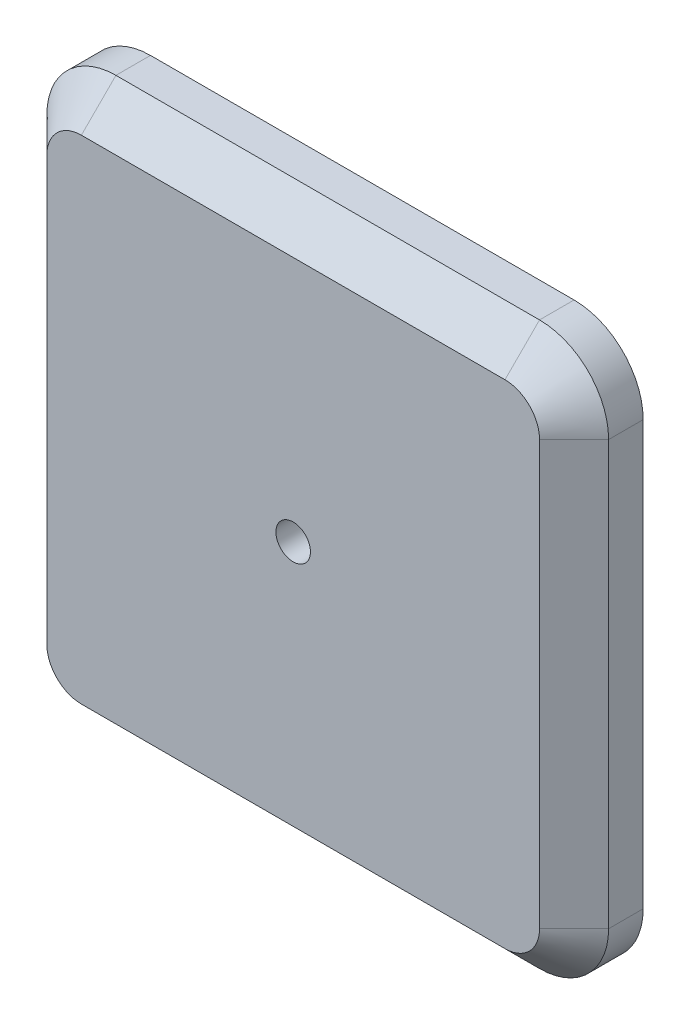
ISO-10303-21;
HEADER;
FILE_DESCRIPTION(('STEP AP214'),'2;1');
FILE_NAME('part.step','',(''),(''),'','','');
FILE_SCHEMA(('AUTOMOTIVE_DESIGN { 1 0 10303 214 1 1 1 1 }'));
ENDSEC;
DATA;
#1=APPLICATION_CONTEXT('core data for automotive mechanical design processes');
#2=APPLICATION_PROTOCOL_DEFINITION('international standard','automotive_design',2000,#1);
#3=PRODUCT_CONTEXT('',#1,'mechanical');
#4=PRODUCT('Part','Part','',(#3));
#5=PRODUCT_RELATED_PRODUCT_CATEGORY('part','',(#4));
#6=PRODUCT_DEFINITION_FORMATION('','',#4);
#7=PRODUCT_DEFINITION_CONTEXT('part definition',#1,'design');
#8=PRODUCT_DEFINITION('design','',#6,#7);
#9=PRODUCT_DEFINITION_SHAPE('','',#8);
#10=(LENGTH_UNIT() NAMED_UNIT(*) SI_UNIT(.MILLI.,.METRE.));
#11=(NAMED_UNIT(*) PLANE_ANGLE_UNIT() SI_UNIT($,.RADIAN.));
#12=(NAMED_UNIT(*) SI_UNIT($,.STERADIAN.) SOLID_ANGLE_UNIT());
#13=UNCERTAINTY_MEASURE_WITH_UNIT(LENGTH_MEASURE(1.E-05),#10,'distance_accuracy_value','');
#14=(GEOMETRIC_REPRESENTATION_CONTEXT(3) GLOBAL_UNCERTAINTY_ASSIGNED_CONTEXT((#13)) GLOBAL_UNIT_ASSIGNED_CONTEXT((#10,
#11,#12)) REPRESENTATION_CONTEXT('',''));
#15=CARTESIAN_POINT('',(0.,0.,0.));
#16=DIRECTION('',(0.,0.,1.));
#17=DIRECTION('',(1.,0.,0.));
#18=AXIS2_PLACEMENT_3D('',#15,#16,#17);
#19=CARTESIAN_POINT('',(-16.2634559672906,-16.2634559672906,4.));
#20=DIRECTION('',(1.,0.,0.));
#21=DIRECTION('',(0.,0.,-1.));
#22=AXIS2_PLACEMENT_3D('',#19,#20,#21);
#23=PLANE('',#22);
#24=DIRECTION('',(0.,0.,-1.));
#25=VECTOR('',#24,1.);
#26=CARTESIAN_POINT('',(-16.2634559672906,-12.2634559672906,4.));
#27=LINE('',#26,#25);
#28=CARTESIAN_POINT('',(-16.2634559672906,-12.2634559672906,0.));
#29=VERTEX_POINT('',#28);
#30=CARTESIAN_POINT('',(-16.2634559672906,-12.2634559672906,2.));
#31=VERTEX_POINT('',#30);
#32=EDGE_CURVE('E151',#29,#31,#27,.F.);
#33=ORIENTED_EDGE('',*,*,#32,.T.);
#34=DIRECTION('',(0.,1.,0.));
#35=VECTOR('',#34,1.);
#36=CARTESIAN_POINT('',(-16.2634559672906,12.2634559672906,2.));
#37=LINE('',#36,#35);
#38=CARTESIAN_POINT('',(-16.2634559672906,12.2634559672906,2.));
#39=VERTEX_POINT('',#38);
#40=EDGE_CURVE('E239',#31,#39,#37,.T.);
#41=ORIENTED_EDGE('',*,*,#40,.T.);
#42=DIRECTION('',(0.,0.,-1.));
#43=VECTOR('',#42,1.);
#44=CARTESIAN_POINT('',(-16.2634559672906,12.2634559672906,4.));
#45=LINE('',#44,#43);
#46=CARTESIAN_POINT('',(-16.2634559672906,12.2634559672906,0.));
#47=VERTEX_POINT('',#46);
#48=EDGE_CURVE('E156',#39,#47,#45,.T.);
#49=ORIENTED_EDGE('',*,*,#48,.T.);
#50=DIRECTION('',(0.,-1.,0.));
#51=VECTOR('',#50,1.);
#52=CARTESIAN_POINT('',(-16.2634559672906,-16.2634559672906,0.));
#53=LINE('',#52,#51);
#54=EDGE_CURVE('E164',#47,#29,#53,.T.);
#55=ORIENTED_EDGE('',*,*,#54,.T.);
#56=EDGE_LOOP('',(#33,#41,#49,#55));
#57=FACE_BOUND('',#56,.T.);
#58=ADVANCED_FACE('F41',(#57),#23,.F.);
#59=CARTESIAN_POINT('',(16.2634559672906,-16.2634559672906,4.));
#60=DIRECTION('',(0.,1.,0.));
#61=DIRECTION('',(-1.,0.,0.));
#62=AXIS2_PLACEMENT_3D('',#59,#60,#61);
#63=PLANE('',#62);
#64=DIRECTION('',(0.,0.,-1.));
#65=VECTOR('',#64,1.);
#66=CARTESIAN_POINT('',(12.2634559672906,-16.2634559672906,4.));
#67=LINE('',#66,#65);
#68=CARTESIAN_POINT('',(12.2634559672906,-16.2634559672906,0.));
#69=VERTEX_POINT('',#68);
#70=CARTESIAN_POINT('',(12.2634559672906,-16.2634559672906,2.));
#71=VERTEX_POINT('',#70);
#72=EDGE_CURVE('E145',#69,#71,#67,.F.);
#73=ORIENTED_EDGE('',*,*,#72,.T.);
#74=DIRECTION('',(-1.,0.,0.));
#75=VECTOR('',#74,1.);
#76=CARTESIAN_POINT('',(-12.2634559672906,-16.2634559672906,2.));
#77=LINE('',#76,#75);
#78=CARTESIAN_POINT('',(-12.2634559672906,-16.2634559672906,2.));
#79=VERTEX_POINT('',#78);
#80=EDGE_CURVE('E141',#71,#79,#77,.T.);
#81=ORIENTED_EDGE('',*,*,#80,.T.);
#82=DIRECTION('',(0.,0.,-1.));
#83=VECTOR('',#82,1.);
#84=CARTESIAN_POINT('',(-12.2634559672906,-16.2634559672906,4.));
#85=LINE('',#84,#83);
#86=CARTESIAN_POINT('',(-12.2634559672906,-16.2634559672906,0.));
#87=VERTEX_POINT('',#86);
#88=EDGE_CURVE('E133',#79,#87,#85,.T.);
#89=ORIENTED_EDGE('',*,*,#88,.T.);
#90=DIRECTION('',(1.,0.,0.));
#91=VECTOR('',#90,1.);
#92=CARTESIAN_POINT('',(16.2634559672906,-16.2634559672906,0.));
#93=LINE('',#92,#91);
#94=EDGE_CURVE('E138',#87,#69,#93,.T.);
#95=ORIENTED_EDGE('',*,*,#94,.T.);
#96=EDGE_LOOP('',(#73,#81,#89,#95));
#97=FACE_BOUND('',#96,.T.);
#98=ADVANCED_FACE('F136',(#97),#63,.F.);
#99=CARTESIAN_POINT('',(16.2634559672906,-16.2634559672906,4.));
#100=DIRECTION('',(-1.,0.,0.));
#101=DIRECTION('',(0.,0.,1.));
#102=AXIS2_PLACEMENT_3D('',#99,#100,#101);
#103=PLANE('',#102);
#104=DIRECTION('',(0.,0.,-1.));
#105=VECTOR('',#104,1.);
#106=CARTESIAN_POINT('',(16.2634559672906,12.2634559672906,4.));
#107=LINE('',#106,#105);
#108=CARTESIAN_POINT('',(16.2634559672906,12.2634559672906,0.));
#109=VERTEX_POINT('',#108);
#110=CARTESIAN_POINT('',(16.2634559672906,12.2634559672906,2.));
#111=VERTEX_POINT('',#110);
#112=EDGE_CURVE('E190',#109,#111,#107,.F.);
#113=ORIENTED_EDGE('',*,*,#112,.T.);
#114=DIRECTION('',(0.,-1.,0.));
#115=VECTOR('',#114,1.);
#116=CARTESIAN_POINT('',(16.2634559672906,-12.2634559672906,2.));
#117=LINE('',#116,#115);
#118=CARTESIAN_POINT('',(16.2634559672906,-12.2634559672906,2.));
#119=VERTEX_POINT('',#118);
#120=EDGE_CURVE('E236',#111,#119,#117,.T.);
#121=ORIENTED_EDGE('',*,*,#120,.T.);
#122=DIRECTION('',(0.,0.,-1.));
#123=VECTOR('',#122,1.);
#124=CARTESIAN_POINT('',(16.2634559672906,-12.2634559672906,4.));
#125=LINE('',#124,#123);
#126=CARTESIAN_POINT('',(16.2634559672906,-12.2634559672906,0.));
#127=VERTEX_POINT('',#126);
#128=EDGE_CURVE('E194',#119,#127,#125,.T.);
#129=ORIENTED_EDGE('',*,*,#128,.T.);
#130=DIRECTION('',(0.,1.,0.));
#131=VECTOR('',#130,1.);
#132=CARTESIAN_POINT('',(16.2634559672906,-16.2634559672906,0.));
#133=LINE('',#132,#131);
#134=EDGE_CURVE('E163',#127,#109,#133,.T.);
#135=ORIENTED_EDGE('',*,*,#134,.T.);
#136=EDGE_LOOP('',(#113,#121,#129,#135));
#137=FACE_BOUND('',#136,.T.);
#138=ADVANCED_FACE('F293',(#137),#103,.F.);
#139=CARTESIAN_POINT('',(16.2634559672906,16.2634559672906,4.));
#140=DIRECTION('',(0.,-1.,0.));
#141=DIRECTION('',(1.,0.,0.));
#142=AXIS2_PLACEMENT_3D('',#139,#140,#141);
#143=PLANE('',#142);
#144=DIRECTION('',(0.,0.,-1.));
#145=VECTOR('',#144,1.);
#146=CARTESIAN_POINT('',(-12.2634559672906,16.2634559672906,4.));
#147=LINE('',#146,#145);
#148=CARTESIAN_POINT('',(-12.2634559672906,16.2634559672906,0.));
#149=VERTEX_POINT('',#148);
#150=CARTESIAN_POINT('',(-12.2634559672906,16.2634559672906,2.));
#151=VERTEX_POINT('',#150);
#152=EDGE_CURVE('E197',#149,#151,#147,.F.);
#153=ORIENTED_EDGE('',*,*,#152,.T.);
#154=DIRECTION('',(1.,0.,0.));
#155=VECTOR('',#154,1.);
#156=CARTESIAN_POINT('',(12.2634559672906,16.2634559672906,2.));
#157=LINE('',#156,#155);
#158=CARTESIAN_POINT('',(12.2634559672906,16.2634559672906,2.));
#159=VERTEX_POINT('',#158);
#160=EDGE_CURVE('E11',#151,#159,#157,.T.);
#161=ORIENTED_EDGE('',*,*,#160,.T.);
#162=DIRECTION('',(0.,0.,-1.));
#163=VECTOR('',#162,1.);
#164=CARTESIAN_POINT('',(12.2634559672906,16.2634559672906,4.));
#165=LINE('',#164,#163);
#166=CARTESIAN_POINT('',(12.2634559672906,16.2634559672906,0.));
#167=VERTEX_POINT('',#166);
#168=EDGE_CURVE('E200',#159,#167,#165,.T.);
#169=ORIENTED_EDGE('',*,*,#168,.T.);
#170=DIRECTION('',(-1.,0.,0.));
#171=VECTOR('',#170,1.);
#172=CARTESIAN_POINT('',(16.2634559672906,16.2634559672906,0.));
#173=LINE('',#172,#171);
#174=EDGE_CURVE('E169',#167,#149,#173,.T.);
#175=ORIENTED_EDGE('',*,*,#174,.T.);
#176=EDGE_LOOP('',(#153,#161,#169,#175));
#177=FACE_BOUND('',#176,.T.);
#178=ADVANCED_FACE('F297',(#177),#143,.F.);
#179=CARTESIAN_POINT('',(0.,0.,4.));
#180=DIRECTION('',(0.,0.,1.));
#181=DIRECTION('',(1.,0.,0.));
#182=AXIS2_PLACEMENT_3D('',#179,#180,#181);
#183=PLANE('',#182);
#184=CARTESIAN_POINT('',(0.,0.,4.));
#185=DIRECTION('',(0.,0.,1.));
#186=DIRECTION('',(1.,0.,0.));
#187=AXIS2_PLACEMENT_3D('',#184,#185,#186);
#188=CIRCLE('',#187,1.);
#189=CARTESIAN_POINT('',(1.,0.,4.));
#190=VERTEX_POINT('',#189);
#191=EDGE_CURVE('E483',#190,#190,#188,.T.);
#192=ORIENTED_EDGE('',*,*,#191,.F.);
#193=EDGE_LOOP('',(#192));
#194=FACE_BOUND('',#193,.T.);
#195=CARTESIAN_POINT('',(-12.2634559672906,-12.2634559672906,4.));
#196=DIRECTION('',(0.,0.,1.));
#197=DIRECTION('',(1.,0.,0.));
#198=AXIS2_PLACEMENT_3D('',#195,#196,#197);
#199=CIRCLE('',#198,2.00000000000001);
#200=CARTESIAN_POINT('',(-14.2634559672906,-12.2634559672906,4.));
#201=VERTEX_POINT('',#200);
#202=CARTESIAN_POINT('',(-12.2634559672906,-14.2634559672906,4.));
#203=VERTEX_POINT('',#202);
#204=EDGE_CURVE('E218',#201,#203,#199,.T.);
#205=ORIENTED_EDGE('',*,*,#204,.T.);
#206=DIRECTION('',(1.,0.,0.));
#207=VECTOR('',#206,1.);
#208=CARTESIAN_POINT('',(12.2634559672906,-14.2634559672906,4.));
#209=LINE('',#208,#207);
#210=CARTESIAN_POINT('',(12.2634559672906,-14.2634559672906,4.));
#211=VERTEX_POINT('',#210);
#212=EDGE_CURVE('E224',#203,#211,#209,.T.);
#213=ORIENTED_EDGE('',*,*,#212,.T.);
#214=CARTESIAN_POINT('',(12.2634559672906,-12.2634559672906,4.));
#215=DIRECTION('',(0.,0.,1.));
#216=DIRECTION('',(1.,0.,0.));
#217=AXIS2_PLACEMENT_3D('',#214,#215,#216);
#218=CIRCLE('',#217,2.00000000000001);
#219=CARTESIAN_POINT('',(14.2634559672906,-12.2634559672906,4.));
#220=VERTEX_POINT('',#219);
#221=EDGE_CURVE('E221',#211,#220,#218,.T.);
#222=ORIENTED_EDGE('',*,*,#221,.T.);
#223=DIRECTION('',(0.,1.,0.));
#224=VECTOR('',#223,1.);
#225=CARTESIAN_POINT('',(14.2634559672906,12.2634559672906,4.));
#226=LINE('',#225,#224);
#227=CARTESIAN_POINT('',(14.2634559672906,12.2634559672906,4.));
#228=VERTEX_POINT('',#227);
#229=EDGE_CURVE('E215',#220,#228,#226,.T.);
#230=ORIENTED_EDGE('',*,*,#229,.T.);
#231=CARTESIAN_POINT('',(12.2634559672906,12.2634559672906,4.));
#232=DIRECTION('',(0.,0.,1.));
#233=DIRECTION('',(1.,0.,0.));
#234=AXIS2_PLACEMENT_3D('',#231,#232,#233);
#235=CIRCLE('',#234,2.00000000000001);
#236=CARTESIAN_POINT('',(12.2634559672906,14.2634559672906,4.));
#237=VERTEX_POINT('',#236);
#238=EDGE_CURVE('E209',#228,#237,#235,.T.);
#239=ORIENTED_EDGE('',*,*,#238,.T.);
#240=DIRECTION('',(-1.,0.,0.));
#241=VECTOR('',#240,1.);
#242=CARTESIAN_POINT('',(-12.2634559672906,14.2634559672906,4.));
#243=LINE('',#242,#241);
#244=CARTESIAN_POINT('',(-12.2634559672906,14.2634559672906,4.));
#245=VERTEX_POINT('',#244);
#246=EDGE_CURVE('E203',#237,#245,#243,.T.);
#247=ORIENTED_EDGE('',*,*,#246,.T.);
#248=CARTESIAN_POINT('',(-12.2634559672906,12.2634559672906,4.));
#249=DIRECTION('',(0.,0.,1.));
#250=DIRECTION('',(1.,0.,0.));
#251=AXIS2_PLACEMENT_3D('',#248,#249,#250);
#252=CIRCLE('',#251,2.00000000000001);
#253=CARTESIAN_POINT('',(-14.2634559672906,12.2634559672906,4.));
#254=VERTEX_POINT('',#253);
#255=EDGE_CURVE('E206',#245,#254,#252,.T.);
#256=ORIENTED_EDGE('',*,*,#255,.T.);
#257=DIRECTION('',(0.,-1.,0.));
#258=VECTOR('',#257,1.);
#259=CARTESIAN_POINT('',(-14.2634559672906,-12.2634559672906,4.));
#260=LINE('',#259,#258);
#261=EDGE_CURVE('E212',#254,#201,#260,.T.);
#262=ORIENTED_EDGE('',*,*,#261,.T.);
#263=EDGE_LOOP('',(#205,#213,#222,#230,#239,#247,#256,#262));
#264=FACE_BOUND('',#263,.T.);
#265=ADVANCED_FACE('F312',(#194,#264),#183,.T.);
#266=CARTESIAN_POINT('',(0.,0.,0.));
#267=DIRECTION('',(0.,0.,1.));
#268=DIRECTION('',(1.,0.,0.));
#269=AXIS2_PLACEMENT_3D('',#266,#267,#268);
#270=PLANE('',#269);
#271=CARTESIAN_POINT('',(0.,0.,0.));
#272=DIRECTION('',(0.,0.,1.));
#273=DIRECTION('',(1.,0.,0.));
#274=AXIS2_PLACEMENT_3D('',#271,#272,#273);
#275=CIRCLE('',#274,1.);
#276=CARTESIAN_POINT('',(1.,0.,0.));
#277=VERTEX_POINT('',#276);
#278=EDGE_CURVE('E251',#277,#277,#275,.T.);
#279=ORIENTED_EDGE('',*,*,#278,.T.);
#280=EDGE_LOOP('',(#279));
#281=FACE_BOUND('',#280,.T.);
#282=ORIENTED_EDGE('',*,*,#94,.F.);
#283=CARTESIAN_POINT('',(-12.2634559672906,-12.2634559672906,0.));
#284=DIRECTION('',(0.,0.,1.));
#285=DIRECTION('',(1.,0.,0.));
#286=AXIS2_PLACEMENT_3D('',#283,#284,#285);
#287=CIRCLE('',#286,4.);
#288=EDGE_CURVE('E148',#87,#29,#287,.F.);
#289=ORIENTED_EDGE('',*,*,#288,.T.);
#290=ORIENTED_EDGE('',*,*,#54,.F.);
#291=CARTESIAN_POINT('',(-12.2634559672906,12.2634559672906,0.));
#292=DIRECTION('',(0.,0.,1.));
#293=DIRECTION('',(1.,0.,0.));
#294=AXIS2_PLACEMENT_3D('',#291,#292,#293);
#295=CIRCLE('',#294,4.);
#296=EDGE_CURVE('E144',#47,#149,#295,.F.);
#297=ORIENTED_EDGE('',*,*,#296,.T.);
#298=ORIENTED_EDGE('',*,*,#174,.F.);
#299=CARTESIAN_POINT('',(12.2634559672906,12.2634559672906,0.));
#300=DIRECTION('',(0.,0.,1.));
#301=DIRECTION('',(1.,0.,0.));
#302=AXIS2_PLACEMENT_3D('',#299,#300,#301);
#303=CIRCLE('',#302,4.);
#304=EDGE_CURVE('E181',#167,#109,#303,.F.);
#305=ORIENTED_EDGE('',*,*,#304,.T.);
#306=ORIENTED_EDGE('',*,*,#134,.F.);
#307=CARTESIAN_POINT('',(12.2634559672906,-12.2634559672906,0.));
#308=DIRECTION('',(0.,0.,1.));
#309=DIRECTION('',(1.,0.,0.));
#310=AXIS2_PLACEMENT_3D('',#307,#308,#309);
#311=CIRCLE('',#310,4.);
#312=EDGE_CURVE('E157',#127,#69,#311,.F.);
#313=ORIENTED_EDGE('',*,*,#312,.T.);
#314=EDGE_LOOP('',(#282,#289,#290,#297,#298,#305,#306,#313));
#315=FACE_BOUND('',#314,.T.);
#316=ADVANCED_FACE('F159',(#281,#315),#270,.F.);
#317=CARTESIAN_POINT('',(-12.2634559672906,-12.2634559672906,4.));
#318=DIRECTION('',(0.,0.,-1.));
#319=DIRECTION('',(-1.,0.,0.));
#320=AXIS2_PLACEMENT_3D('',#317,#318,#319);
#321=CYLINDRICAL_SURFACE('',#320,4.);
#322=ORIENTED_EDGE('',*,*,#88,.F.);
#323=CARTESIAN_POINT('',(-12.2634559672906,-12.2634559672906,2.));
#324=DIRECTION('',(0.,0.,1.));
#325=DIRECTION('',(1.,0.,0.));
#326=AXIS2_PLACEMENT_3D('',#323,#324,#325);
#327=CIRCLE('',#326,4.);
#328=EDGE_CURVE('E233',#79,#31,#327,.F.);
#329=ORIENTED_EDGE('',*,*,#328,.T.);
#330=ORIENTED_EDGE('',*,*,#32,.F.);
#331=ORIENTED_EDGE('',*,*,#288,.F.);
#332=EDGE_LOOP('',(#322,#329,#330,#331));
#333=FACE_BOUND('',#332,.T.);
#334=ADVANCED_FACE('F149',(#333),#321,.T.);
#335=CARTESIAN_POINT('',(12.2634559672906,-12.2634559672906,4.));
#336=DIRECTION('',(0.,0.,-1.));
#337=DIRECTION('',(-1.,0.,0.));
#338=AXIS2_PLACEMENT_3D('',#335,#336,#337);
#339=CYLINDRICAL_SURFACE('',#338,4.);
#340=ORIENTED_EDGE('',*,*,#128,.F.);
#341=CARTESIAN_POINT('',(12.2634559672906,-12.2634559672906,2.));
#342=DIRECTION('',(0.,0.,1.));
#343=DIRECTION('',(1.,0.,0.));
#344=AXIS2_PLACEMENT_3D('',#341,#342,#343);
#345=CIRCLE('',#344,4.);
#346=EDGE_CURVE('E230',#119,#71,#345,.F.);
#347=ORIENTED_EDGE('',*,*,#346,.T.);
#348=ORIENTED_EDGE('',*,*,#72,.F.);
#349=ORIENTED_EDGE('',*,*,#312,.F.);
#350=EDGE_LOOP('',(#340,#347,#348,#349));
#351=FACE_BOUND('',#350,.T.);
#352=ADVANCED_FACE('F323',(#351),#339,.T.);
#353=CARTESIAN_POINT('',(12.2634559672906,12.2634559672906,4.));
#354=DIRECTION('',(0.,0.,-1.));
#355=DIRECTION('',(-1.,0.,0.));
#356=AXIS2_PLACEMENT_3D('',#353,#354,#355);
#357=CYLINDRICAL_SURFACE('',#356,4.);
#358=ORIENTED_EDGE('',*,*,#168,.F.);
#359=CARTESIAN_POINT('',(12.2634559672906,12.2634559672906,2.));
#360=DIRECTION('',(0.,0.,1.));
#361=DIRECTION('',(1.,0.,0.));
#362=AXIS2_PLACEMENT_3D('',#359,#360,#361);
#363=CIRCLE('',#362,4.);
#364=EDGE_CURVE('E242',#159,#111,#363,.F.);
#365=ORIENTED_EDGE('',*,*,#364,.T.);
#366=ORIENTED_EDGE('',*,*,#112,.F.);
#367=ORIENTED_EDGE('',*,*,#304,.F.);
#368=EDGE_LOOP('',(#358,#365,#366,#367));
#369=FACE_BOUND('',#368,.T.);
#370=ADVANCED_FACE('F290',(#369),#357,.T.);
#371=CARTESIAN_POINT('',(-12.2634559672906,12.2634559672906,4.));
#372=DIRECTION('',(0.,0.,-1.));
#373=DIRECTION('',(-1.,0.,0.));
#374=AXIS2_PLACEMENT_3D('',#371,#372,#373);
#375=CYLINDRICAL_SURFACE('',#374,4.);
#376=ORIENTED_EDGE('',*,*,#48,.F.);
#377=CARTESIAN_POINT('',(-12.2634559672906,12.2634559672906,2.));
#378=DIRECTION('',(0.,0.,1.));
#379=DIRECTION('',(1.,0.,0.));
#380=AXIS2_PLACEMENT_3D('',#377,#378,#379);
#381=CIRCLE('',#380,4.);
#382=EDGE_CURVE('E51',#39,#151,#381,.F.);
#383=ORIENTED_EDGE('',*,*,#382,.T.);
#384=ORIENTED_EDGE('',*,*,#152,.F.);
#385=ORIENTED_EDGE('',*,*,#296,.F.);
#386=EDGE_LOOP('',(#376,#383,#384,#385));
#387=FACE_BOUND('',#386,.T.);
#388=ADVANCED_FACE('F298',(#387),#375,.T.);
#389=CARTESIAN_POINT('',(0.,14.2634559672906,4.));
#390=DIRECTION('',(0.,0.70710678118655,0.707106781186545));
#391=DIRECTION('',(1.,0.,0.));
#392=AXIS2_PLACEMENT_3D('',#389,#390,#391);
#393=PLANE('',#392);
#394=DIRECTION('',(0.,-0.707106781186545,0.70710678118655));
#395=VECTOR('',#394,1.);
#396=CARTESIAN_POINT('',(12.2634559672906,16.2634559672906,2.));
#397=LINE('',#396,#395);
#398=EDGE_CURVE('E269',#159,#237,#397,.T.);
#399=ORIENTED_EDGE('',*,*,#398,.F.);
#400=ORIENTED_EDGE('',*,*,#160,.F.);
#401=DIRECTION('',(0.,0.707106781186545,-0.70710678118655));
#402=VECTOR('',#401,1.);
#403=CARTESIAN_POINT('',(-12.2634559672906,14.2634559672906,4.));
#404=LINE('',#403,#402);
#405=EDGE_CURVE('E45',#245,#151,#404,.T.);
#406=ORIENTED_EDGE('',*,*,#405,.F.);
#407=ORIENTED_EDGE('',*,*,#246,.F.);
#408=EDGE_LOOP('',(#399,#400,#406,#407));
#409=FACE_BOUND('',#408,.T.);
#410=ADVANCED_FACE('F43',(#409),#393,.T.);
#411=CARTESIAN_POINT('',(-12.2634559672906,12.2634559672906,4.));
#412=DIRECTION('',(0.,0.,-1.));
#413=DIRECTION('',(-1.,0.,0.));
#414=AXIS2_PLACEMENT_3D('',#411,#412,#413);
#415=CONICAL_SURFACE('',#414,2.00000000000001,0.785398163397445);
#416=ORIENTED_EDGE('',*,*,#405,.T.);
#417=ORIENTED_EDGE('',*,*,#382,.F.);
#418=DIRECTION('',(-0.707106781186545,0.,-0.70710678118655));
#419=VECTOR('',#418,1.);
#420=CARTESIAN_POINT('',(-14.2634559672906,12.2634559672906,4.));
#421=LINE('',#420,#419);
#422=EDGE_CURVE('E266',#254,#39,#421,.T.);
#423=ORIENTED_EDGE('',*,*,#422,.F.);
#424=ORIENTED_EDGE('',*,*,#255,.F.);
#425=EDGE_LOOP('',(#416,#417,#423,#424));
#426=FACE_BOUND('',#425,.T.);
#427=ADVANCED_FACE('F281',(#426),#415,.T.);
#428=CARTESIAN_POINT('',(12.2634559672906,12.2634559672906,4.));
#429=DIRECTION('',(0.,0.,-1.));
#430=DIRECTION('',(-1.,0.,0.));
#431=AXIS2_PLACEMENT_3D('',#428,#429,#430);
#432=CONICAL_SURFACE('',#431,2.00000000000001,0.785398163397445);
#433=ORIENTED_EDGE('',*,*,#398,.T.);
#434=ORIENTED_EDGE('',*,*,#238,.F.);
#435=DIRECTION('',(-0.707106781186545,0.,0.70710678118655));
#436=VECTOR('',#435,1.);
#437=CARTESIAN_POINT('',(16.2634559672906,12.2634559672906,2.));
#438=LINE('',#437,#436);
#439=EDGE_CURVE('E262',#111,#228,#438,.T.);
#440=ORIENTED_EDGE('',*,*,#439,.F.);
#441=ORIENTED_EDGE('',*,*,#364,.F.);
#442=EDGE_LOOP('',(#433,#434,#440,#441));
#443=FACE_BOUND('',#442,.T.);
#444=ADVANCED_FACE('F286',(#443),#432,.T.);
#445=CARTESIAN_POINT('',(-14.2634559672906,0.,4.));
#446=DIRECTION('',(-0.70710678118655,0.,0.707106781186545));
#447=DIRECTION('',(0.,1.,0.));
#448=AXIS2_PLACEMENT_3D('',#445,#446,#447);
#449=PLANE('',#448);
#450=ORIENTED_EDGE('',*,*,#422,.T.);
#451=ORIENTED_EDGE('',*,*,#40,.F.);
#452=DIRECTION('',(-0.707106781186545,0.,-0.70710678118655));
#453=VECTOR('',#452,1.);
#454=CARTESIAN_POINT('',(-14.2634559672906,-12.2634559672906,4.));
#455=LINE('',#454,#453);
#456=EDGE_CURVE('E258',#201,#31,#455,.T.);
#457=ORIENTED_EDGE('',*,*,#456,.F.);
#458=ORIENTED_EDGE('',*,*,#261,.F.);
#459=EDGE_LOOP('',(#450,#451,#457,#458));
#460=FACE_BOUND('',#459,.T.);
#461=ADVANCED_FACE('F303',(#460),#449,.T.);
#462=CARTESIAN_POINT('',(14.2634559672906,0.,4.));
#463=DIRECTION('',(0.70710678118655,0.,0.707106781186545));
#464=DIRECTION('',(0.,-1.,0.));
#465=AXIS2_PLACEMENT_3D('',#462,#463,#464);
#466=PLANE('',#465);
#467=ORIENTED_EDGE('',*,*,#439,.T.);
#468=ORIENTED_EDGE('',*,*,#229,.F.);
#469=DIRECTION('',(-0.707106781186545,0.,0.70710678118655));
#470=VECTOR('',#469,1.);
#471=CARTESIAN_POINT('',(16.2634559672906,-12.2634559672906,2.));
#472=LINE('',#471,#470);
#473=EDGE_CURVE('E254',#119,#220,#472,.T.);
#474=ORIENTED_EDGE('',*,*,#473,.F.);
#475=ORIENTED_EDGE('',*,*,#120,.F.);
#476=EDGE_LOOP('',(#467,#468,#474,#475));
#477=FACE_BOUND('',#476,.T.);
#478=ADVANCED_FACE('F315',(#477),#466,.T.);
#479=CARTESIAN_POINT('',(-12.2634559672906,-12.2634559672906,4.));
#480=DIRECTION('',(0.,0.,-1.));
#481=DIRECTION('',(-1.,0.,0.));
#482=AXIS2_PLACEMENT_3D('',#479,#480,#481);
#483=CONICAL_SURFACE('',#482,2.00000000000001,0.785398163397445);
#484=ORIENTED_EDGE('',*,*,#456,.T.);
#485=ORIENTED_EDGE('',*,*,#328,.F.);
#486=DIRECTION('',(0.,-0.707106781186545,-0.70710678118655));
#487=VECTOR('',#486,1.);
#488=CARTESIAN_POINT('',(-12.2634559672906,-14.2634559672906,4.));
#489=LINE('',#488,#487);
#490=EDGE_CURVE('E250',#203,#79,#489,.T.);
#491=ORIENTED_EDGE('',*,*,#490,.F.);
#492=ORIENTED_EDGE('',*,*,#204,.F.);
#493=EDGE_LOOP('',(#484,#485,#491,#492));
#494=FACE_BOUND('',#493,.T.);
#495=ADVANCED_FACE('F308',(#494),#483,.T.);
#496=CARTESIAN_POINT('',(12.2634559672906,-12.2634559672906,4.));
#497=DIRECTION('',(0.,0.,-1.));
#498=DIRECTION('',(-1.,0.,0.));
#499=AXIS2_PLACEMENT_3D('',#496,#497,#498);
#500=CONICAL_SURFACE('',#499,2.00000000000001,0.785398163397445);
#501=ORIENTED_EDGE('',*,*,#473,.T.);
#502=ORIENTED_EDGE('',*,*,#221,.F.);
#503=DIRECTION('',(0.,0.707106781186545,0.70710678118655));
#504=VECTOR('',#503,1.);
#505=CARTESIAN_POINT('',(12.2634559672906,-16.2634559672906,2.));
#506=LINE('',#505,#504);
#507=EDGE_CURVE('E247',#71,#211,#506,.T.);
#508=ORIENTED_EDGE('',*,*,#507,.F.);
#509=ORIENTED_EDGE('',*,*,#346,.F.);
#510=EDGE_LOOP('',(#501,#502,#508,#509));
#511=FACE_BOUND('',#510,.T.);
#512=ADVANCED_FACE('F321',(#511),#500,.T.);
#513=CARTESIAN_POINT('',(0.,-14.2634559672906,4.));
#514=DIRECTION('',(0.,-0.70710678118655,0.707106781186545));
#515=DIRECTION('',(-1.,0.,0.));
#516=AXIS2_PLACEMENT_3D('',#513,#514,#515);
#517=PLANE('',#516);
#518=ORIENTED_EDGE('',*,*,#490,.T.);
#519=ORIENTED_EDGE('',*,*,#80,.F.);
#520=ORIENTED_EDGE('',*,*,#507,.T.);
#521=ORIENTED_EDGE('',*,*,#212,.F.);
#522=EDGE_LOOP('',(#518,#519,#520,#521));
#523=FACE_BOUND('',#522,.T.);
#524=ADVANCED_FACE('F325',(#523),#517,.T.);
#525=CARTESIAN_POINT('',(0.,0.,0.));
#526=DIRECTION('',(0.,0.,1.));
#527=DIRECTION('',(1.,0.,0.));
#528=AXIS2_PLACEMENT_3D('',#525,#526,#527);
#529=CYLINDRICAL_SURFACE('',#528,1.);
#530=ORIENTED_EDGE('',*,*,#278,.F.);
#531=EDGE_LOOP('',(#530));
#532=FACE_BOUND('',#531,.T.);
#533=ORIENTED_EDGE('',*,*,#191,.T.);
#534=EDGE_LOOP('',(#533));
#535=FACE_BOUND('',#534,.T.);
#536=ADVANCED_FACE('F327',(#532,#535),#529,.F.);
#537=CLOSED_SHELL('',(#58,#98,#138,#178,#265,#316,#334,#352,#370,#388,#410,#427,#444,#461,#478,
#495,#512,#524,#536));
#538=MANIFOLD_SOLID_BREP('B2',#537);
#539=ADVANCED_BREP_SHAPE_REPRESENTATION('',(#18,#538),#14);
#540=SHAPE_DEFINITION_REPRESENTATION(#9,#539);
ENDSEC;
END-ISO-10303-21;
